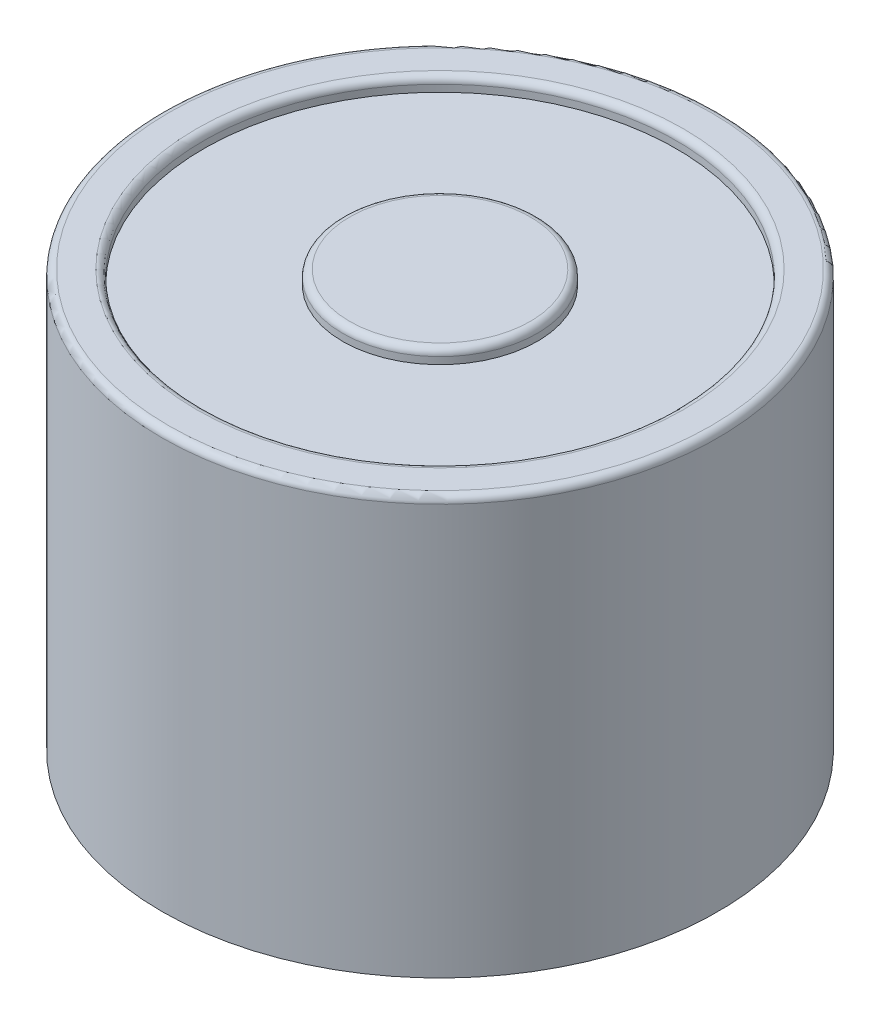
ISO-10303-21;
HEADER;
FILE_DESCRIPTION(('STEP AP214'),'2;1');
FILE_NAME('part.step','',(''),(''),'','','');
FILE_SCHEMA(('AUTOMOTIVE_DESIGN { 1 0 10303 214 1 1 1 1 }'));
ENDSEC;
DATA;
#1=APPLICATION_CONTEXT('core data for automotive mechanical design processes');
#2=APPLICATION_PROTOCOL_DEFINITION('international standard','automotive_design',2000,#1);
#3=PRODUCT_CONTEXT('',#1,'mechanical');
#4=PRODUCT('Part','Part','',(#3));
#5=PRODUCT_RELATED_PRODUCT_CATEGORY('part','',(#4));
#6=PRODUCT_DEFINITION_FORMATION('','',#4);
#7=PRODUCT_DEFINITION_CONTEXT('part definition',#1,'design');
#8=PRODUCT_DEFINITION('design','',#6,#7);
#9=PRODUCT_DEFINITION_SHAPE('','',#8);
#10=(LENGTH_UNIT() NAMED_UNIT(*) SI_UNIT(.MILLI.,.METRE.));
#11=(NAMED_UNIT(*) PLANE_ANGLE_UNIT() SI_UNIT($,.RADIAN.));
#12=(NAMED_UNIT(*) SI_UNIT($,.STERADIAN.) SOLID_ANGLE_UNIT());
#13=UNCERTAINTY_MEASURE_WITH_UNIT(LENGTH_MEASURE(1.E-05),#10,'distance_accuracy_value','');
#14=(GEOMETRIC_REPRESENTATION_CONTEXT(3) GLOBAL_UNCERTAINTY_ASSIGNED_CONTEXT((#13)) GLOBAL_UNIT_ASSIGNED_CONTEXT((#10,
#11,#12)) REPRESENTATION_CONTEXT('',''));
#15=CARTESIAN_POINT('',(0.,0.,0.));
#16=DIRECTION('',(0.,0.,1.));
#17=DIRECTION('',(1.,0.,0.));
#18=AXIS2_PLACEMENT_3D('',#15,#16,#17);
#19=CARTESIAN_POINT('',(0.,15.,0.));
#20=DIRECTION('',(0.,-1.,0.));
#21=DIRECTION('',(0.,0.,-1.));
#22=AXIS2_PLACEMENT_3D('',#19,#20,#21);
#23=CYLINDRICAL_SURFACE('',#22,10.);
#24=CARTESIAN_POINT('',(0.,14.75,0.));
#25=DIRECTION('',(0.,1.,0.));
#26=DIRECTION('',(0.,0.,1.));
#27=AXIS2_PLACEMENT_3D('',#24,#25,#26);
#28=CIRCLE('',#27,10.);
#29=CARTESIAN_POINT('',(0.,14.75,10.));
#30=VERTEX_POINT('',#29);
#31=EDGE_CURVE('E10',#30,#30,#28,.F.);
#32=ORIENTED_EDGE('',*,*,#31,.T.);
#33=EDGE_LOOP('',(#32));
#34=FACE_BOUND('',#33,.T.);
#35=CARTESIAN_POINT('',(0.,0.,0.));
#36=DIRECTION('',(0.,1.,0.));
#37=DIRECTION('',(0.,0.,1.));
#38=AXIS2_PLACEMENT_3D('',#35,#36,#37);
#39=CIRCLE('',#38,10.);
#40=CARTESIAN_POINT('',(0.,0.,10.));
#41=VERTEX_POINT('',#40);
#42=EDGE_CURVE('E65',#41,#41,#39,.T.);
#43=ORIENTED_EDGE('',*,*,#42,.T.);
#44=EDGE_LOOP('',(#43));
#45=FACE_BOUND('',#44,.T.);
#46=ADVANCED_FACE('F39',(#34,#45),#23,.T.);
#47=CARTESIAN_POINT('',(0.,15.,0.));
#48=DIRECTION('',(0.,1.,0.));
#49=DIRECTION('',(0.,0.,1.));
#50=AXIS2_PLACEMENT_3D('',#47,#48,#49);
#51=PLANE('',#50);
#52=CARTESIAN_POINT('',(0.,15.,0.));
#53=DIRECTION('',(0.,1.,0.));
#54=DIRECTION('',(0.,0.,1.));
#55=AXIS2_PLACEMENT_3D('',#52,#53,#54);
#56=CIRCLE('',#55,8.75);
#57=CARTESIAN_POINT('',(0.,15.,8.75));
#58=VERTEX_POINT('',#57);
#59=EDGE_CURVE('E46',#58,#58,#56,.F.);
#60=ORIENTED_EDGE('',*,*,#59,.T.);
#61=EDGE_LOOP('',(#60));
#62=FACE_BOUND('',#61,.T.);
#63=CARTESIAN_POINT('',(0.,15.,0.));
#64=DIRECTION('',(0.,1.,0.));
#65=DIRECTION('',(0.,0.,1.));
#66=AXIS2_PLACEMENT_3D('',#63,#64,#65);
#67=CIRCLE('',#66,9.75);
#68=CARTESIAN_POINT('',(0.,15.,9.75));
#69=VERTEX_POINT('',#68);
#70=EDGE_CURVE('E50',#69,#69,#67,.T.);
#71=ORIENTED_EDGE('',*,*,#70,.T.);
#72=EDGE_LOOP('',(#71));
#73=FACE_BOUND('',#72,.T.);
#74=ADVANCED_FACE('F93',(#62,#73),#51,.T.);
#75=CARTESIAN_POINT('',(0.,0.,0.));
#76=DIRECTION('',(0.,1.,0.));
#77=DIRECTION('',(0.,0.,1.));
#78=AXIS2_PLACEMENT_3D('',#75,#76,#77);
#79=PLANE('',#78);
#80=ORIENTED_EDGE('',*,*,#42,.F.);
#81=EDGE_LOOP('',(#80));
#82=FACE_BOUND('',#81,.T.);
#83=ADVANCED_FACE('F85',(#82),#79,.F.);
#84=CARTESIAN_POINT('',(0.,14.5,0.));
#85=DIRECTION('',(0.,1.,0.));
#86=DIRECTION('',(0.,0.,1.));
#87=AXIS2_PLACEMENT_3D('',#84,#85,#86);
#88=CYLINDRICAL_SURFACE('',#87,8.5);
#89=CARTESIAN_POINT('',(0.,14.75,0.));
#90=DIRECTION('',(0.,1.,0.));
#91=DIRECTION('',(0.,0.,1.));
#92=AXIS2_PLACEMENT_3D('',#89,#90,#91);
#93=CIRCLE('',#92,8.5);
#94=CARTESIAN_POINT('',(0.,14.75,8.5));
#95=VERTEX_POINT('',#94);
#96=EDGE_CURVE('E54',#95,#95,#93,.T.);
#97=ORIENTED_EDGE('',*,*,#96,.T.);
#98=EDGE_LOOP('',(#97));
#99=FACE_BOUND('',#98,.T.);
#100=CARTESIAN_POINT('',(0.,14.5,0.));
#101=DIRECTION('',(0.,1.,0.));
#102=DIRECTION('',(0.,0.,1.));
#103=AXIS2_PLACEMENT_3D('',#100,#101,#102);
#104=CIRCLE('',#103,8.5);
#105=CARTESIAN_POINT('',(0.,14.5,8.5));
#106=VERTEX_POINT('',#105);
#107=EDGE_CURVE('E68',#106,#106,#104,.T.);
#108=ORIENTED_EDGE('',*,*,#107,.F.);
#109=EDGE_LOOP('',(#108));
#110=FACE_BOUND('',#109,.T.);
#111=ADVANCED_FACE('F80',(#99,#110),#88,.F.);
#112=CARTESIAN_POINT('',(0.,14.5,0.));
#113=DIRECTION('',(0.,1.,0.));
#114=DIRECTION('',(0.,0.,1.));
#115=AXIS2_PLACEMENT_3D('',#112,#113,#114);
#116=PLANE('',#115);
#117=CARTESIAN_POINT('',(0.,14.5,0.));
#118=DIRECTION('',(0.,1.,0.));
#119=DIRECTION('',(0.,0.,1.));
#120=AXIS2_PLACEMENT_3D('',#117,#118,#119);
#121=CIRCLE('',#120,3.5);
#122=CARTESIAN_POINT('',(0.,14.5,3.5));
#123=VERTEX_POINT('',#122);
#124=EDGE_CURVE('E71',#123,#123,#121,.T.);
#125=ORIENTED_EDGE('',*,*,#124,.F.);
#126=EDGE_LOOP('',(#125));
#127=FACE_BOUND('',#126,.T.);
#128=ORIENTED_EDGE('',*,*,#107,.T.);
#129=EDGE_LOOP('',(#128));
#130=FACE_BOUND('',#129,.T.);
#131=ADVANCED_FACE('F77',(#127,#130),#116,.T.);
#132=CARTESIAN_POINT('',(0.,15.,0.));
#133=DIRECTION('',(0.,-1.,0.));
#134=DIRECTION('',(0.,0.,-1.));
#135=AXIS2_PLACEMENT_3D('',#132,#133,#134);
#136=CYLINDRICAL_SURFACE('',#135,3.5);
#137=CARTESIAN_POINT('',(0.,14.75,0.));
#138=DIRECTION('',(0.,1.,0.));
#139=DIRECTION('',(0.,0.,1.));
#140=AXIS2_PLACEMENT_3D('',#137,#138,#139);
#141=CIRCLE('',#140,3.5);
#142=CARTESIAN_POINT('',(0.,14.75,3.5));
#143=VERTEX_POINT('',#142);
#144=EDGE_CURVE('E59',#143,#143,#141,.F.);
#145=ORIENTED_EDGE('',*,*,#144,.T.);
#146=EDGE_LOOP('',(#145));
#147=FACE_BOUND('',#146,.T.);
#148=ORIENTED_EDGE('',*,*,#124,.T.);
#149=EDGE_LOOP('',(#148));
#150=FACE_BOUND('',#149,.T.);
#151=ADVANCED_FACE('F75',(#147,#150),#136,.T.);
#152=CARTESIAN_POINT('',(0.,15.,0.));
#153=DIRECTION('',(0.,1.,0.));
#154=DIRECTION('',(0.,0.,1.));
#155=AXIS2_PLACEMENT_3D('',#152,#153,#154);
#156=PLANE('',#155);
#157=CARTESIAN_POINT('',(0.,15.,0.));
#158=DIRECTION('',(0.,1.,0.));
#159=DIRECTION('',(0.,0.,1.));
#160=AXIS2_PLACEMENT_3D('',#157,#158,#159);
#161=CIRCLE('',#160,3.25);
#162=CARTESIAN_POINT('',(0.,15.,3.25));
#163=VERTEX_POINT('',#162);
#164=EDGE_CURVE('E62',#163,#163,#161,.T.);
#165=ORIENTED_EDGE('',*,*,#164,.T.);
#166=EDGE_LOOP('',(#165));
#167=FACE_BOUND('',#166,.T.);
#168=ADVANCED_FACE('F107',(#167),#156,.T.);
#169=CARTESIAN_POINT('',(0.,14.75,0.));
#170=DIRECTION('',(0.,1.,0.));
#171=DIRECTION('',(0.,0.,1.));
#172=AXIS2_PLACEMENT_3D('',#169,#170,#171);
#173=TOROIDAL_SURFACE('',#172,3.25,0.25);
#174=ORIENTED_EDGE('',*,*,#144,.F.);
#175=EDGE_LOOP('',(#174));
#176=FACE_BOUND('',#175,.T.);
#177=ORIENTED_EDGE('',*,*,#164,.F.);
#178=EDGE_LOOP('',(#177));
#179=FACE_BOUND('',#178,.T.);
#180=ADVANCED_FACE('F104',(#176,#179),#173,.T.);
#181=CARTESIAN_POINT('',(0.,14.75,0.));
#182=DIRECTION('',(0.,1.,0.));
#183=DIRECTION('',(0.,0.,1.));
#184=AXIS2_PLACEMENT_3D('',#181,#182,#183);
#185=TOROIDAL_SURFACE('',#184,8.75,0.25);
#186=ORIENTED_EDGE('',*,*,#59,.F.);
#187=EDGE_LOOP('',(#186));
#188=FACE_BOUND('',#187,.T.);
#189=ORIENTED_EDGE('',*,*,#96,.F.);
#190=EDGE_LOOP('',(#189));
#191=FACE_BOUND('',#190,.T.);
#192=ADVANCED_FACE('F106',(#188,#191),#185,.T.);
#193=CARTESIAN_POINT('',(0.,14.75,0.));
#194=DIRECTION('',(0.,1.,0.));
#195=DIRECTION('',(0.,0.,1.));
#196=AXIS2_PLACEMENT_3D('',#193,#194,#195);
#197=TOROIDAL_SURFACE('',#196,9.75,0.25);
#198=ORIENTED_EDGE('',*,*,#31,.F.);
#199=EDGE_LOOP('',(#198));
#200=FACE_BOUND('',#199,.T.);
#201=ORIENTED_EDGE('',*,*,#70,.F.);
#202=EDGE_LOOP('',(#201));
#203=FACE_BOUND('',#202,.T.);
#204=ADVANCED_FACE('F41',(#200,#203),#197,.T.);
#205=CLOSED_SHELL('',(#46,#74,#83,#111,#131,#151,#168,#180,#192,#204));
#206=MANIFOLD_SOLID_BREP('B2',#205);
#207=ADVANCED_BREP_SHAPE_REPRESENTATION('',(#18,#206),#14);
#208=SHAPE_DEFINITION_REPRESENTATION(#9,#207);
ENDSEC;
END-ISO-10303-21;
